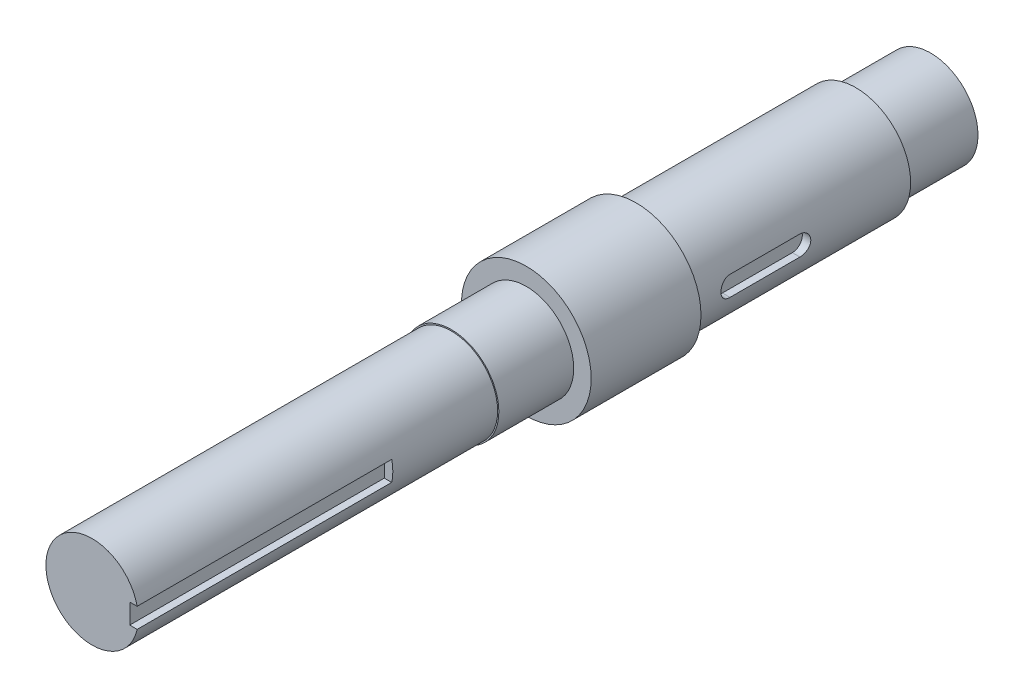
ISO-10303-21;
HEADER;
FILE_DESCRIPTION(('STEP AP214'),'2;1');
FILE_NAME('part.step','',(''),(''),'','','');
FILE_SCHEMA(('AUTOMOTIVE_DESIGN { 1 0 10303 214 1 1 1 1 }'));
ENDSEC;
DATA;
#1=APPLICATION_CONTEXT('core data for automotive mechanical design processes');
#2=APPLICATION_PROTOCOL_DEFINITION('international standard','automotive_design',2000,#1);
#3=PRODUCT_CONTEXT('',#1,'mechanical');
#4=PRODUCT('Part','Part','',(#3));
#5=PRODUCT_RELATED_PRODUCT_CATEGORY('part','',(#4));
#6=PRODUCT_DEFINITION_FORMATION('','',#4);
#7=PRODUCT_DEFINITION_CONTEXT('part definition',#1,'design');
#8=PRODUCT_DEFINITION('design','',#6,#7);
#9=PRODUCT_DEFINITION_SHAPE('','',#8);
#10=(LENGTH_UNIT() NAMED_UNIT(*) SI_UNIT(.MILLI.,.METRE.));
#11=(NAMED_UNIT(*) PLANE_ANGLE_UNIT() SI_UNIT($,.RADIAN.));
#12=(NAMED_UNIT(*) SI_UNIT($,.STERADIAN.) SOLID_ANGLE_UNIT());
#13=UNCERTAINTY_MEASURE_WITH_UNIT(LENGTH_MEASURE(1.E-05),#10,'distance_accuracy_value','');
#14=(GEOMETRIC_REPRESENTATION_CONTEXT(3) GLOBAL_UNCERTAINTY_ASSIGNED_CONTEXT((#13)) GLOBAL_UNIT_ASSIGNED_CONTEXT((#10,
#11,#12)) REPRESENTATION_CONTEXT('',''));
#15=CARTESIAN_POINT('',(0.,0.,0.));
#16=DIRECTION('',(0.,0.,1.));
#17=DIRECTION('',(1.,0.,0.));
#18=AXIS2_PLACEMENT_3D('',#15,#16,#17);
#19=CARTESIAN_POINT('',(0.,0.,0.));
#20=DIRECTION('',(0.,0.,-1.));
#21=DIRECTION('',(-1.,0.,0.));
#22=AXIS2_PLACEMENT_3D('',#19,#20,#21);
#23=PLANE('',#22);
#24=DIRECTION('',(0.,-1.,0.));
#25=VECTOR('',#24,1.);
#26=CARTESIAN_POINT('',(7.55,2.,0.));
#27=LINE('',#26,#25);
#28=CARTESIAN_POINT('',(7.55,2.,0.));
#29=VERTEX_POINT('',#28);
#30=CARTESIAN_POINT('',(7.55,-2.,0.));
#31=VERTEX_POINT('',#30);
#32=EDGE_CURVE('E142',#29,#31,#27,.T.);
#33=ORIENTED_EDGE('',*,*,#32,.F.);
#34=DIRECTION('',(-1.,0.,0.));
#35=VECTOR('',#34,1.);
#36=CARTESIAN_POINT('',(7.55,2.,0.));
#37=LINE('',#36,#35);
#38=CARTESIAN_POINT('',(9.03119593409422,2.,0.));
#39=VERTEX_POINT('',#38);
#40=EDGE_CURVE('E152',#39,#29,#37,.T.);
#41=ORIENTED_EDGE('',*,*,#40,.F.);
#42=CARTESIAN_POINT('',(0.,0.,0.));
#43=DIRECTION('',(0.,0.,1.));
#44=DIRECTION('',(1.,0.,0.));
#45=AXIS2_PLACEMENT_3D('',#42,#43,#44);
#46=CIRCLE('',#45,9.25);
#47=CARTESIAN_POINT('',(9.03119593409422,-2.,0.));
#48=VERTEX_POINT('',#47);
#49=EDGE_CURVE('E209',#39,#48,#46,.T.);
#50=ORIENTED_EDGE('',*,*,#49,.T.);
#51=DIRECTION('',(1.,0.,0.));
#52=VECTOR('',#51,1.);
#53=CARTESIAN_POINT('',(7.55,-2.,0.));
#54=LINE('',#53,#52);
#55=EDGE_CURVE('E162',#31,#48,#54,.T.);
#56=ORIENTED_EDGE('',*,*,#55,.F.);
#57=EDGE_LOOP('',(#33,#41,#50,#56));
#58=FACE_BOUND('',#57,.T.);
#59=ADVANCED_FACE('F43',(#58),#23,.F.);
#60=CARTESIAN_POINT('',(0.,0.,0.));
#61=DIRECTION('',(0.,0.,1.));
#62=DIRECTION('',(1.,0.,0.));
#63=AXIS2_PLACEMENT_3D('',#60,#61,#62);
#64=CYLINDRICAL_SURFACE('',#63,9.25);
#65=ORIENTED_EDGE('',*,*,#49,.F.);
#66=DIRECTION('',(0.,0.,1.));
#67=VECTOR('',#66,1.);
#68=CARTESIAN_POINT('',(9.03119593409422,2.,0.));
#69=LINE('',#68,#67);
#70=CARTESIAN_POINT('',(9.03119593409422,2.,-51.));
#71=VERTEX_POINT('',#70);
#72=EDGE_CURVE('E220',#39,#71,#69,.F.);
#73=ORIENTED_EDGE('',*,*,#72,.T.);
#74=CARTESIAN_POINT('',(0.,0.,-51.));
#75=DIRECTION('',(0.,0.,1.));
#76=DIRECTION('',(1.,0.,0.));
#77=AXIS2_PLACEMENT_3D('',#74,#75,#76);
#78=CIRCLE('',#77,9.25);
#79=CARTESIAN_POINT('',(9.03119593409422,-2.,-51.));
#80=VERTEX_POINT('',#79);
#81=EDGE_CURVE('E213',#80,#71,#78,.T.);
#82=ORIENTED_EDGE('',*,*,#81,.F.);
#83=DIRECTION('',(0.,0.,1.));
#84=VECTOR('',#83,1.);
#85=CARTESIAN_POINT('',(9.03119593409422,-2.,0.));
#86=LINE('',#85,#84);
#87=EDGE_CURVE('E216',#80,#48,#86,.T.);
#88=ORIENTED_EDGE('',*,*,#87,.T.);
#89=EDGE_LOOP('',(#65,#73,#82,#88));
#90=FACE_BOUND('',#89,.T.);
#91=CARTESIAN_POINT('',(0.,0.,-72.));
#92=DIRECTION('',(0.,0.,1.));
#93=DIRECTION('',(1.,0.,0.));
#94=AXIS2_PLACEMENT_3D('',#91,#92,#93);
#95=CIRCLE('',#94,9.25);
#96=CARTESIAN_POINT('',(9.25,0.,-72.));
#97=VERTEX_POINT('',#96);
#98=EDGE_CURVE('E205',#97,#97,#95,.T.);
#99=ORIENTED_EDGE('',*,*,#98,.T.);
#100=EDGE_LOOP('',(#99));
#101=FACE_BOUND('',#100,.T.);
#102=ADVANCED_FACE('F288',(#90,#101),#64,.T.);
#103=CARTESIAN_POINT('',(-9.25,0.,-72.));
#104=DIRECTION('',(0.,0.,-1.));
#105=DIRECTION('',(-1.,0.,0.));
#106=AXIS2_PLACEMENT_3D('',#103,#104,#105);
#107=PLANE('',#106);
#108=ORIENTED_EDGE('',*,*,#98,.F.);
#109=EDGE_LOOP('',(#108));
#110=FACE_BOUND('',#109,.T.);
#111=CARTESIAN_POINT('',(0.,0.,-72.));
#112=DIRECTION('',(0.,0.,1.));
#113=DIRECTION('',(1.,0.,0.));
#114=AXIS2_PLACEMENT_3D('',#111,#112,#113);
#115=CIRCLE('',#114,9.5);
#116=CARTESIAN_POINT('',(9.5,0.,-72.));
#117=VERTEX_POINT('',#116);
#118=EDGE_CURVE('E201',#117,#117,#115,.T.);
#119=ORIENTED_EDGE('',*,*,#118,.T.);
#120=EDGE_LOOP('',(#119));
#121=FACE_BOUND('',#120,.T.);
#122=ADVANCED_FACE('F293',(#110,#121),#107,.F.);
#123=CARTESIAN_POINT('',(0.,0.,0.));
#124=DIRECTION('',(0.,0.,1.));
#125=DIRECTION('',(1.,0.,0.));
#126=AXIS2_PLACEMENT_3D('',#123,#124,#125);
#127=CYLINDRICAL_SURFACE('',#126,9.5);
#128=ORIENTED_EDGE('',*,*,#118,.F.);
#129=EDGE_LOOP('',(#128));
#130=FACE_BOUND('',#129,.T.);
#131=CARTESIAN_POINT('',(0.,0.,-87.));
#132=DIRECTION('',(0.,0.,1.));
#133=DIRECTION('',(1.,0.,0.));
#134=AXIS2_PLACEMENT_3D('',#131,#132,#133);
#135=CIRCLE('',#134,9.5);
#136=CARTESIAN_POINT('',(9.5,0.,-87.));
#137=VERTEX_POINT('',#136);
#138=EDGE_CURVE('E197',#137,#137,#135,.T.);
#139=ORIENTED_EDGE('',*,*,#138,.T.);
#140=EDGE_LOOP('',(#139));
#141=FACE_BOUND('',#140,.T.);
#142=ADVANCED_FACE('F308',(#130,#141),#127,.T.);
#143=CARTESIAN_POINT('',(-9.5,0.,-87.));
#144=DIRECTION('',(0.,0.,-1.));
#145=DIRECTION('',(-1.,0.,0.));
#146=AXIS2_PLACEMENT_3D('',#143,#144,#145);
#147=PLANE('',#146);
#148=ORIENTED_EDGE('',*,*,#138,.F.);
#149=EDGE_LOOP('',(#148));
#150=FACE_BOUND('',#149,.T.);
#151=CARTESIAN_POINT('',(0.,0.,-87.));
#152=DIRECTION('',(0.,0.,1.));
#153=DIRECTION('',(1.,0.,0.));
#154=AXIS2_PLACEMENT_3D('',#151,#152,#153);
#155=CIRCLE('',#154,13.);
#156=CARTESIAN_POINT('',(13.,0.,-87.));
#157=VERTEX_POINT('',#156);
#158=EDGE_CURVE('E193',#157,#157,#155,.T.);
#159=ORIENTED_EDGE('',*,*,#158,.T.);
#160=EDGE_LOOP('',(#159));
#161=FACE_BOUND('',#160,.T.);
#162=ADVANCED_FACE('F314',(#150,#161),#147,.F.);
#163=CARTESIAN_POINT('',(0.,0.,0.));
#164=DIRECTION('',(0.,0.,1.));
#165=DIRECTION('',(1.,0.,0.));
#166=AXIS2_PLACEMENT_3D('',#163,#164,#165);
#167=CYLINDRICAL_SURFACE('',#166,13.);
#168=ORIENTED_EDGE('',*,*,#158,.F.);
#169=EDGE_LOOP('',(#168));
#170=FACE_BOUND('',#169,.T.);
#171=CARTESIAN_POINT('',(0.,0.,-109.));
#172=DIRECTION('',(0.,0.,1.));
#173=DIRECTION('',(1.,0.,0.));
#174=AXIS2_PLACEMENT_3D('',#171,#172,#173);
#175=CIRCLE('',#174,13.);
#176=CARTESIAN_POINT('',(13.,0.,-109.));
#177=VERTEX_POINT('',#176);
#178=EDGE_CURVE('E189',#177,#177,#175,.T.);
#179=ORIENTED_EDGE('',*,*,#178,.T.);
#180=EDGE_LOOP('',(#179));
#181=FACE_BOUND('',#180,.T.);
#182=ADVANCED_FACE('F320',(#170,#181),#167,.T.);
#183=CARTESIAN_POINT('',(-13.,0.,-109.));
#184=DIRECTION('',(0.,0.,1.));
#185=DIRECTION('',(1.,0.,0.));
#186=AXIS2_PLACEMENT_3D('',#183,#184,#185);
#187=PLANE('',#186);
#188=ORIENTED_EDGE('',*,*,#178,.F.);
#189=EDGE_LOOP('',(#188));
#190=FACE_BOUND('',#189,.T.);
#191=CARTESIAN_POINT('',(0.,0.,-109.));
#192=DIRECTION('',(0.,0.,1.));
#193=DIRECTION('',(1.,0.,0.));
#194=AXIS2_PLACEMENT_3D('',#191,#192,#193);
#195=CIRCLE('',#194,11.);
#196=CARTESIAN_POINT('',(11.,0.,-109.));
#197=VERTEX_POINT('',#196);
#198=EDGE_CURVE('E185',#197,#197,#195,.T.);
#199=ORIENTED_EDGE('',*,*,#198,.T.);
#200=EDGE_LOOP('',(#199));
#201=FACE_BOUND('',#200,.T.);
#202=ADVANCED_FACE('F283',(#190,#201),#187,.F.);
#203=CARTESIAN_POINT('',(0.,0.,0.));
#204=DIRECTION('',(0.,0.,1.));
#205=DIRECTION('',(1.,0.,0.));
#206=AXIS2_PLACEMENT_3D('',#203,#204,#205);
#207=CYLINDRICAL_SURFACE('',#206,11.);
#208=DIRECTION('',(0.,0.,1.));
#209=VECTOR('',#208,1.);
#210=CARTESIAN_POINT('',(10.816653826392,-2.,0.));
#211=LINE('',#210,#209);
#212=CARTESIAN_POINT('',(10.816653826392,-2.,-131.));
#213=VERTEX_POINT('',#212);
#214=CARTESIAN_POINT('',(10.816653826392,-2.,-117.));
#215=VERTEX_POINT('',#214);
#216=EDGE_CURVE('E11',#213,#215,#211,.T.);
#217=ORIENTED_EDGE('',*,*,#216,.T.);
#218=CARTESIAN_POINT('',(10.816653826392,-2.,-117.));
#219=CARTESIAN_POINT('',(10.816651258914,-2.00000018061634,-116.94422806179));
#220=CARTESIAN_POINT('',(10.8170857257361,-1.99766564189374,-116.888483307638));
#221=CARTESIAN_POINT('',(10.8188018840597,-1.98835585116647,-116.77740195715));
#222=CARTESIAN_POINT('',(10.8200834821592,-1.98138111077478,-116.722065316498));
#223=CARTESIAN_POINT('',(10.8251511920414,-1.95358097793237,-116.557428897521));
#224=CARTESIAN_POINT('',(10.8301604591789,-1.92587936906751,-116.449246575579));
#225=CARTESIAN_POINT('',(10.8428701687926,-1.85297540358901,-116.239167889975));
#226=CARTESIAN_POINT('',(10.8505710757285,-1.80777002644227,-116.137272614756));
#227=CARTESIAN_POINT('',(10.8677925398683,-1.70117309929226,-115.942488301224));
#228=CARTESIAN_POINT('',(10.8773131921923,-1.63978070311046,-115.849599734083));
#229=CARTESIAN_POINT('',(10.8972242664715,-1.50179830833211,-115.67441910933));
#230=CARTESIAN_POINT('',(10.907622686189,-1.42505726961891,-115.592246965078));
#231=CARTESIAN_POINT('',(10.9280480310746,-1.25887349016363,-115.441860980772));
#232=CARTESIAN_POINT('',(10.9380748988687,-1.16942879797534,-115.373649289161));
#233=CARTESIAN_POINT('',(10.9567125004528,-0.97959074459269,-115.252670876904));
#234=CARTESIAN_POINT('',(10.9653126265614,-0.879123860827199,-115.200017756166));
#235=CARTESIAN_POINT('',(10.9800371178379,-0.670593727576967,-115.112384733669));
#236=CARTESIAN_POINT('',(10.9861618124014,-0.562531491023177,-115.077402480364));
#237=CARTESIAN_POINT('',(10.9951890525403,-0.343126126847998,-115.026473059217));
#238=CARTESIAN_POINT('',(10.9981260767462,-0.231831754809527,-115.010322063021));
#239=CARTESIAN_POINT('',(11.0005658200381,-0.0080741245845282,-114.996878772328));
#240=CARTESIAN_POINT('',(11.0000687341353,0.104389066866689,-114.999585406972));
#241=CARTESIAN_POINT('',(10.9957231782306,0.325889572271524,-115.023624179995));
#242=CARTESIAN_POINT('',(10.9919142825436,0.434951642726337,-115.044736389689));
#243=CARTESIAN_POINT('',(10.981417423868,0.647958197325631,-115.104639468903));
#244=CARTESIAN_POINT('',(10.9747293801769,0.751902537929274,-115.14343083397));
#245=CARTESIAN_POINT('',(10.9591590664214,0.952367985634635,-115.237803859247));
#246=CARTESIAN_POINT('',(10.9502652164866,1.04884627383009,-115.293474485543));
#247=CARTESIAN_POINT('',(10.9312686142379,1.23117066093661,-115.419958494387));
#248=CARTESIAN_POINT('',(10.9211657884069,1.31701611262433,-115.490772798019));
#249=CARTESIAN_POINT('',(10.9007004580746,1.47693363459026,-115.646737494747));
#250=CARTESIAN_POINT('',(10.8903363063026,1.55081969037311,-115.732078500144));
#251=CARTESIAN_POINT('',(10.8706521448259,1.68327703651511,-115.914069686334));
#252=CARTESIAN_POINT('',(10.8613324290478,1.74184402191302,-116.010723035097));
#253=CARTESIAN_POINT('',(10.8447889040507,1.84205005134385,-116.21284701707));
#254=CARTESIAN_POINT('',(10.8375695040655,1.88365355603979,-116.318335609233));
#255=CARTESIAN_POINT('',(10.8261116120234,1.94843731479773,-116.534895164335));
#256=CARTESIAN_POINT('',(10.8218686733341,1.97164505765592,-116.645957533283));
#257=CARTESIAN_POINT('',(10.8184599236414,1.99021053132189,-116.798236341417));
#258=CARTESIAN_POINT('',(10.8177833008864,1.99388300652338,-116.838534153267));
#259=CARTESIAN_POINT('',(10.8168806740202,1.99877459457026,-116.919215355627));
#260=CARTESIAN_POINT('',(10.8166539128778,1.99999782905127,-116.959598487689));
#261=CARTESIAN_POINT('',(10.816653826392,2.,-117.));
#262=B_SPLINE_CURVE_WITH_KNOTS('',3,(#218,#219,#220,#221,#222,#223,#224,#225,#226,#227,#228,
#229,#230,#231,#232,#233,#234,#235,#236,#237,#238,#239,#240,#241,#242,#243,#244,#245,#246,#247,
#248,#249,#250,#251,#252,#253,#254,#255,#256,#257,#258,#259,#260,#261),.UNSPECIFIED.,.F.,.F.,(4,
2,2,2,2,2,2,2,2,2,2,2,2,2,2,2,2,2,2,2,2,4),(0.,0.167211555817646,0.334404678508456,
0.668032690697008,1.00171830099124,1.3354213582039,1.6725859449139,2.00980238061477,
2.34942336653652,2.68899914557081,3.02486421591156,3.36071021380238,3.69259734638405,
4.02449378235842,4.35817089733143,4.69186831333993,5.03033996174505,5.36890662542208,
5.7081790029471,6.04694344478351,6.16829654969758,6.28944526674888),.UNSPECIFIED.);
#263=CARTESIAN_POINT('',(10.816653826392,2.,-117.));
#264=VERTEX_POINT('',#263);
#265=EDGE_CURVE('E224',#215,#264,#262,.T.);
#266=ORIENTED_EDGE('',*,*,#265,.T.);
#267=DIRECTION('',(0.,0.,1.));
#268=VECTOR('',#267,1.);
#269=CARTESIAN_POINT('',(10.816653826392,2.,0.));
#270=LINE('',#269,#268);
#271=CARTESIAN_POINT('',(10.816653826392,2.,-131.));
#272=VERTEX_POINT('',#271);
#273=EDGE_CURVE('E51',#264,#272,#270,.F.);
#274=ORIENTED_EDGE('',*,*,#273,.T.);
#275=CARTESIAN_POINT('',(10.816653826392,2.,-131.));
#276=CARTESIAN_POINT('',(10.816651258914,2.00000018061634,-131.05577193821));
#277=CARTESIAN_POINT('',(10.8170857257361,1.99766564189373,-131.111516692362));
#278=CARTESIAN_POINT('',(10.8188018840597,1.98835585116647,-131.22259804285));
#279=CARTESIAN_POINT('',(10.8200834821592,1.98138111077478,-131.277934683502));
#280=CARTESIAN_POINT('',(10.8251511920414,1.95358097793237,-131.442571102479));
#281=CARTESIAN_POINT('',(10.8301604591789,1.9258793690675,-131.550753424421));
#282=CARTESIAN_POINT('',(10.8428701687926,1.852975403589,-131.760832110025));
#283=CARTESIAN_POINT('',(10.8505710757285,1.80777002644226,-131.862727385244));
#284=CARTESIAN_POINT('',(10.8677925398683,1.70117309929225,-132.057511698777));
#285=CARTESIAN_POINT('',(10.8773131921923,1.63978070311045,-132.150400265917));
#286=CARTESIAN_POINT('',(10.8972242664715,1.5017983083321,-132.32558089067));
#287=CARTESIAN_POINT('',(10.907622686189,1.4250572696189,-132.407753034922));
#288=CARTESIAN_POINT('',(10.9280480310746,1.25887349016362,-132.558139019228));
#289=CARTESIAN_POINT('',(10.9380748988687,1.16942879797533,-132.626350710839));
#290=CARTESIAN_POINT('',(10.9567125004528,0.979590744592674,-132.747329123096));
#291=CARTESIAN_POINT('',(10.9653126265614,0.879123860827184,-132.799982243834));
#292=CARTESIAN_POINT('',(10.9800371178379,0.670593727576952,-132.887615266331));
#293=CARTESIAN_POINT('',(10.9861618124014,0.562531491023159,-132.922597519636));
#294=CARTESIAN_POINT('',(10.9951890525403,0.343126126847981,-132.973526940783));
#295=CARTESIAN_POINT('',(10.9981260767462,0.231831754809513,-132.989677936979));
#296=CARTESIAN_POINT('',(11.0005658200381,0.00807412458451988,-133.003121227672));
#297=CARTESIAN_POINT('',(11.0000687341353,-0.104389066866695,-133.000414593028));
#298=CARTESIAN_POINT('',(10.9957231782306,-0.325889572271526,-132.976375820005));
#299=CARTESIAN_POINT('',(10.9919142825436,-0.434951642726337,-132.955263610311));
#300=CARTESIAN_POINT('',(10.981417423868,-0.647958197325633,-132.895360531098));
#301=CARTESIAN_POINT('',(10.9747293801769,-0.751902537929278,-132.85656916603));
#302=CARTESIAN_POINT('',(10.9591590664214,-0.952367985634642,-132.762196140753));
#303=CARTESIAN_POINT('',(10.9502652164866,-1.0488462738301,-132.706525514457));
#304=CARTESIAN_POINT('',(10.9312686142379,-1.23117066093661,-132.580041505613));
#305=CARTESIAN_POINT('',(10.9211657884069,-1.31701611262433,-132.509227201981));
#306=CARTESIAN_POINT('',(10.9007004580746,-1.47693363459026,-132.353262505253));
#307=CARTESIAN_POINT('',(10.8903363063026,-1.55081969037311,-132.267921499856));
#308=CARTESIAN_POINT('',(10.8706521448259,-1.68327703651512,-132.085930313666));
#309=CARTESIAN_POINT('',(10.8613324290478,-1.74184402191302,-131.989276964903));
#310=CARTESIAN_POINT('',(10.8447889040507,-1.84205005134386,-131.78715298293));
#311=CARTESIAN_POINT('',(10.8375695040655,-1.8836535560398,-131.681664390767));
#312=CARTESIAN_POINT('',(10.8261116120234,-1.94843731479774,-131.465104835665));
#313=CARTESIAN_POINT('',(10.8218686733341,-1.97164505765593,-131.354042466717));
#314=CARTESIAN_POINT('',(10.8184599236414,-1.9902105313219,-131.201763658583));
#315=CARTESIAN_POINT('',(10.8177833008864,-1.99388300652339,-131.161465846733));
#316=CARTESIAN_POINT('',(10.8168806740201,-1.99877459457026,-131.080784644373));
#317=CARTESIAN_POINT('',(10.8166539128778,-1.99999782905128,-131.040401512311));
#318=CARTESIAN_POINT('',(10.816653826392,-2.,-131.));
#319=B_SPLINE_CURVE_WITH_KNOTS('',3,(#275,#276,#277,#278,#279,#280,#281,#282,#283,#284,#285,
#286,#287,#288,#289,#290,#291,#292,#293,#294,#295,#296,#297,#298,#299,#300,#301,#302,#303,#304,
#305,#306,#307,#308,#309,#310,#311,#312,#313,#314,#315,#316,#317,#318),.UNSPECIFIED.,.F.,.F.,(4,
2,2,2,2,2,2,2,2,2,2,2,2,2,2,2,2,2,2,2,2,4),(0.,0.167211555817618,0.334404678508414,
0.668032690697008,1.00171830099127,1.33542135820391,1.6725859449139,2.00980238061477,
2.34942336653652,2.68899914557082,3.02486421591156,3.36071021380238,3.69259734638404,
4.02449378235842,4.35817089733143,4.69186831333993,5.03033996174504,5.36890662542208,
5.70817900294709,6.0469434447835,6.1682965496976,6.28944526674888),.UNSPECIFIED.);
#320=EDGE_CURVE('E58',#272,#213,#319,.T.);
#321=ORIENTED_EDGE('',*,*,#320,.T.);
#322=EDGE_LOOP('',(#217,#266,#274,#321));
#323=FACE_BOUND('',#322,.T.);
#324=ORIENTED_EDGE('',*,*,#198,.F.);
#325=EDGE_LOOP('',(#324));
#326=FACE_BOUND('',#325,.T.);
#327=CARTESIAN_POINT('',(0.,0.,-153.));
#328=DIRECTION('',(0.,0.,1.));
#329=DIRECTION('',(1.,0.,0.));
#330=AXIS2_PLACEMENT_3D('',#327,#328,#329);
#331=CIRCLE('',#330,11.);
#332=CARTESIAN_POINT('',(11.,0.,-153.));
#333=VERTEX_POINT('',#332);
#334=EDGE_CURVE('E181',#333,#333,#331,.T.);
#335=ORIENTED_EDGE('',*,*,#334,.T.);
#336=EDGE_LOOP('',(#335));
#337=FACE_BOUND('',#336,.T.);
#338=ADVANCED_FACE('F239',(#323,#326,#337),#207,.T.);
#339=CARTESIAN_POINT('',(-11.,0.,-153.));
#340=DIRECTION('',(0.,0.,1.));
#341=DIRECTION('',(1.,0.,0.));
#342=AXIS2_PLACEMENT_3D('',#339,#340,#341);
#343=PLANE('',#342);
#344=ORIENTED_EDGE('',*,*,#334,.F.);
#345=EDGE_LOOP('',(#344));
#346=FACE_BOUND('',#345,.T.);
#347=CARTESIAN_POINT('',(0.,0.,-153.));
#348=DIRECTION('',(0.,0.,1.));
#349=DIRECTION('',(1.,0.,0.));
#350=AXIS2_PLACEMENT_3D('',#347,#348,#349);
#351=CIRCLE('',#350,9.5);
#352=CARTESIAN_POINT('',(9.5,0.,-153.));
#353=VERTEX_POINT('',#352);
#354=EDGE_CURVE('E177',#353,#353,#351,.T.);
#355=ORIENTED_EDGE('',*,*,#354,.T.);
#356=EDGE_LOOP('',(#355));
#357=FACE_BOUND('',#356,.T.);
#358=ADVANCED_FACE('F276',(#346,#357),#343,.F.);
#359=CARTESIAN_POINT('',(0.,0.,0.));
#360=DIRECTION('',(0.,0.,1.));
#361=DIRECTION('',(1.,0.,0.));
#362=AXIS2_PLACEMENT_3D('',#359,#360,#361);
#363=CYLINDRICAL_SURFACE('',#362,9.5);
#364=ORIENTED_EDGE('',*,*,#354,.F.);
#365=EDGE_LOOP('',(#364));
#366=FACE_BOUND('',#365,.T.);
#367=CARTESIAN_POINT('',(0.,0.,-168.));
#368=DIRECTION('',(0.,0.,1.));
#369=DIRECTION('',(1.,0.,0.));
#370=AXIS2_PLACEMENT_3D('',#367,#368,#369);
#371=CIRCLE('',#370,9.5);
#372=CARTESIAN_POINT('',(9.5,0.,-168.));
#373=VERTEX_POINT('',#372);
#374=EDGE_CURVE('E171',#373,#373,#371,.T.);
#375=ORIENTED_EDGE('',*,*,#374,.T.);
#376=EDGE_LOOP('',(#375));
#377=FACE_BOUND('',#376,.T.);
#378=ADVANCED_FACE('F273',(#366,#377),#363,.T.);
#379=CARTESIAN_POINT('',(-9.5,0.,-168.));
#380=DIRECTION('',(0.,0.,1.));
#381=DIRECTION('',(1.,0.,0.));
#382=AXIS2_PLACEMENT_3D('',#379,#380,#381);
#383=PLANE('',#382);
#384=ORIENTED_EDGE('',*,*,#374,.F.);
#385=EDGE_LOOP('',(#384));
#386=FACE_BOUND('',#385,.T.);
#387=ADVANCED_FACE('F263',(#386),#383,.F.);
#388=CARTESIAN_POINT('',(7.55,2.,-51.));
#389=DIRECTION('',(0.,1.,0.));
#390=DIRECTION('',(0.,0.,1.));
#391=AXIS2_PLACEMENT_3D('',#388,#389,#390);
#392=PLANE('',#391);
#393=ORIENTED_EDGE('',*,*,#40,.T.);
#394=DIRECTION('',(0.,0.,1.));
#395=VECTOR('',#394,1.);
#396=CARTESIAN_POINT('',(7.55,2.,-51.));
#397=LINE('',#396,#395);
#398=CARTESIAN_POINT('',(7.55,2.,-51.));
#399=VERTEX_POINT('',#398);
#400=EDGE_CURVE('E167',#399,#29,#397,.T.);
#401=ORIENTED_EDGE('',*,*,#400,.F.);
#402=DIRECTION('',(-1.,0.,0.));
#403=VECTOR('',#402,1.);
#404=CARTESIAN_POINT('',(7.55,2.,-51.));
#405=LINE('',#404,#403);
#406=EDGE_CURVE('E155',#71,#399,#405,.T.);
#407=ORIENTED_EDGE('',*,*,#406,.F.);
#408=ORIENTED_EDGE('',*,*,#72,.F.);
#409=EDGE_LOOP('',(#393,#401,#407,#408));
#410=FACE_BOUND('',#409,.T.);
#411=ADVANCED_FACE('F260',(#410),#392,.F.);
#412=CARTESIAN_POINT('',(7.55,-2.,-51.));
#413=DIRECTION('',(0.,-1.,0.));
#414=DIRECTION('',(0.,0.,-1.));
#415=AXIS2_PLACEMENT_3D('',#412,#413,#414);
#416=PLANE('',#415);
#417=DIRECTION('',(1.,0.,0.));
#418=VECTOR('',#417,1.);
#419=CARTESIAN_POINT('',(7.55,-2.,-51.));
#420=LINE('',#419,#418);
#421=CARTESIAN_POINT('',(7.55,-2.,-51.));
#422=VERTEX_POINT('',#421);
#423=EDGE_CURVE('E66',#422,#80,#420,.T.);
#424=ORIENTED_EDGE('',*,*,#423,.F.);
#425=DIRECTION('',(0.,0.,1.));
#426=VECTOR('',#425,1.);
#427=CARTESIAN_POINT('',(7.55,-2.,-51.));
#428=LINE('',#427,#426);
#429=EDGE_CURVE('E158',#422,#31,#428,.T.);
#430=ORIENTED_EDGE('',*,*,#429,.T.);
#431=ORIENTED_EDGE('',*,*,#55,.T.);
#432=ORIENTED_EDGE('',*,*,#87,.F.);
#433=EDGE_LOOP('',(#424,#430,#431,#432));
#434=FACE_BOUND('',#433,.T.);
#435=ADVANCED_FACE('F259',(#434),#416,.F.);
#436=CARTESIAN_POINT('',(0.,0.,-51.));
#437=DIRECTION('',(0.,0.,1.));
#438=DIRECTION('',(1.,0.,0.));
#439=AXIS2_PLACEMENT_3D('',#436,#437,#438);
#440=PLANE('',#439);
#441=ORIENTED_EDGE('',*,*,#81,.T.);
#442=ORIENTED_EDGE('',*,*,#406,.T.);
#443=DIRECTION('',(0.,-1.,0.));
#444=VECTOR('',#443,1.);
#445=CARTESIAN_POINT('',(7.55,2.,-51.));
#446=LINE('',#445,#444);
#447=EDGE_CURVE('E149',#399,#422,#446,.T.);
#448=ORIENTED_EDGE('',*,*,#447,.T.);
#449=ORIENTED_EDGE('',*,*,#423,.T.);
#450=EDGE_LOOP('',(#441,#442,#448,#449));
#451=FACE_BOUND('',#450,.T.);
#452=ADVANCED_FACE('F256',(#451),#440,.T.);
#453=CARTESIAN_POINT('',(7.55,2.,-51.));
#454=DIRECTION('',(-1.,0.,0.));
#455=DIRECTION('',(0.,0.,1.));
#456=AXIS2_PLACEMENT_3D('',#453,#454,#455);
#457=PLANE('',#456);
#458=ORIENTED_EDGE('',*,*,#32,.T.);
#459=ORIENTED_EDGE('',*,*,#429,.F.);
#460=ORIENTED_EDGE('',*,*,#447,.F.);
#461=ORIENTED_EDGE('',*,*,#400,.T.);
#462=EDGE_LOOP('',(#458,#459,#460,#461));
#463=FACE_BOUND('',#462,.T.);
#464=ADVANCED_FACE('F255',(#463),#457,.F.);
#465=CARTESIAN_POINT('',(9.3,0.,-131.));
#466=DIRECTION('',(1.,0.,0.));
#467=DIRECTION('',(0.,0.,-1.));
#468=AXIS2_PLACEMENT_3D('',#465,#466,#467);
#469=CYLINDRICAL_SURFACE('',#468,2.);
#470=DIRECTION('',(1.,0.,0.));
#471=VECTOR('',#470,1.);
#472=CARTESIAN_POINT('',(9.3,2.,-131.));
#473=LINE('',#472,#471);
#474=CARTESIAN_POINT('',(9.3,2.,-131.));
#475=VERTEX_POINT('',#474);
#476=EDGE_CURVE('E108',#475,#272,#473,.T.);
#477=ORIENTED_EDGE('',*,*,#476,.F.);
#478=CARTESIAN_POINT('',(9.3,0.,-131.));
#479=DIRECTION('',(1.,0.,0.));
#480=DIRECTION('',(0.,0.,-1.));
#481=AXIS2_PLACEMENT_3D('',#478,#479,#480);
#482=CIRCLE('',#481,2.);
#483=CARTESIAN_POINT('',(9.3,-2.,-131.));
#484=VERTEX_POINT('',#483);
#485=EDGE_CURVE('E112',#484,#475,#482,.T.);
#486=ORIENTED_EDGE('',*,*,#485,.F.);
#487=DIRECTION('',(1.,0.,0.));
#488=VECTOR('',#487,1.);
#489=CARTESIAN_POINT('',(9.3,-2.,-131.));
#490=LINE('',#489,#488);
#491=EDGE_CURVE('E139',#484,#213,#490,.T.);
#492=ORIENTED_EDGE('',*,*,#491,.T.);
#493=ORIENTED_EDGE('',*,*,#320,.F.);
#494=EDGE_LOOP('',(#477,#486,#492,#493));
#495=FACE_BOUND('',#494,.T.);
#496=ADVANCED_FACE('F110',(#495),#469,.F.);
#497=CARTESIAN_POINT('',(9.3,-2.,-117.));
#498=DIRECTION('',(0.,-1.,0.));
#499=DIRECTION('',(0.,0.,-1.));
#500=AXIS2_PLACEMENT_3D('',#497,#498,#499);
#501=PLANE('',#500);
#502=ORIENTED_EDGE('',*,*,#491,.F.);
#503=DIRECTION('',(0.,0.,-1.));
#504=VECTOR('',#503,1.);
#505=CARTESIAN_POINT('',(9.3,-2.,-117.));
#506=LINE('',#505,#504);
#507=CARTESIAN_POINT('',(9.3,-2.,-117.));
#508=VERTEX_POINT('',#507);
#509=EDGE_CURVE('E118',#508,#484,#506,.T.);
#510=ORIENTED_EDGE('',*,*,#509,.F.);
#511=DIRECTION('',(1.,0.,0.));
#512=VECTOR('',#511,1.);
#513=CARTESIAN_POINT('',(9.3,-2.,-117.));
#514=LINE('',#513,#512);
#515=EDGE_CURVE('E143',#508,#215,#514,.T.);
#516=ORIENTED_EDGE('',*,*,#515,.T.);
#517=ORIENTED_EDGE('',*,*,#216,.F.);
#518=EDGE_LOOP('',(#502,#510,#516,#517));
#519=FACE_BOUND('',#518,.T.);
#520=ADVANCED_FACE('F248',(#519),#501,.F.);
#521=CARTESIAN_POINT('',(9.3,0.,-117.));
#522=DIRECTION('',(1.,0.,0.));
#523=DIRECTION('',(0.,0.,-1.));
#524=AXIS2_PLACEMENT_3D('',#521,#522,#523);
#525=CYLINDRICAL_SURFACE('',#524,2.);
#526=ORIENTED_EDGE('',*,*,#515,.F.);
#527=CARTESIAN_POINT('',(9.3,0.,-117.));
#528=DIRECTION('',(1.,0.,0.));
#529=DIRECTION('',(0.,0.,1.));
#530=AXIS2_PLACEMENT_3D('',#527,#528,#529);
#531=CIRCLE('',#530,2.);
#532=CARTESIAN_POINT('',(9.3,2.,-117.));
#533=VERTEX_POINT('',#532);
#534=EDGE_CURVE('E128',#533,#508,#531,.T.);
#535=ORIENTED_EDGE('',*,*,#534,.F.);
#536=DIRECTION('',(1.,0.,0.));
#537=VECTOR('',#536,1.);
#538=CARTESIAN_POINT('',(9.3,2.,-117.));
#539=LINE('',#538,#537);
#540=EDGE_CURVE('E117',#533,#264,#539,.T.);
#541=ORIENTED_EDGE('',*,*,#540,.T.);
#542=ORIENTED_EDGE('',*,*,#265,.F.);
#543=EDGE_LOOP('',(#526,#535,#541,#542));
#544=FACE_BOUND('',#543,.T.);
#545=ADVANCED_FACE('F243',(#544),#525,.F.);
#546=CARTESIAN_POINT('',(9.3,2.,-117.));
#547=DIRECTION('',(0.,1.,0.));
#548=DIRECTION('',(0.,0.,1.));
#549=AXIS2_PLACEMENT_3D('',#546,#547,#548);
#550=PLANE('',#549);
#551=ORIENTED_EDGE('',*,*,#540,.F.);
#552=DIRECTION('',(0.,0.,1.));
#553=VECTOR('',#552,1.);
#554=CARTESIAN_POINT('',(9.3,2.,-117.));
#555=LINE('',#554,#553);
#556=EDGE_CURVE('E121',#475,#533,#555,.T.);
#557=ORIENTED_EDGE('',*,*,#556,.F.);
#558=ORIENTED_EDGE('',*,*,#476,.T.);
#559=ORIENTED_EDGE('',*,*,#273,.F.);
#560=EDGE_LOOP('',(#551,#557,#558,#559));
#561=FACE_BOUND('',#560,.T.);
#562=ADVANCED_FACE('F122',(#561),#550,.F.);
#563=CARTESIAN_POINT('',(9.3,0.,-131.));
#564=DIRECTION('',(1.,0.,0.));
#565=DIRECTION('',(0.,0.,-1.));
#566=AXIS2_PLACEMENT_3D('',#563,#564,#565);
#567=PLANE('',#566);
#568=ORIENTED_EDGE('',*,*,#485,.T.);
#569=ORIENTED_EDGE('',*,*,#556,.T.);
#570=ORIENTED_EDGE('',*,*,#534,.T.);
#571=ORIENTED_EDGE('',*,*,#509,.T.);
#572=EDGE_LOOP('',(#568,#569,#570,#571));
#573=FACE_BOUND('',#572,.T.);
#574=ADVANCED_FACE('F130',(#573),#567,.T.);
#575=CLOSED_SHELL('',(#59,#102,#122,#142,#162,#182,#202,#338,#358,#378,#387,#411,#435,#452,#464,
#496,#520,#545,#562,#574));
#576=MANIFOLD_SOLID_BREP('B2',#575);
#577=ADVANCED_BREP_SHAPE_REPRESENTATION('',(#18,#576),#14);
#578=SHAPE_DEFINITION_REPRESENTATION(#9,#577);
ENDSEC;
END-ISO-10303-21;
